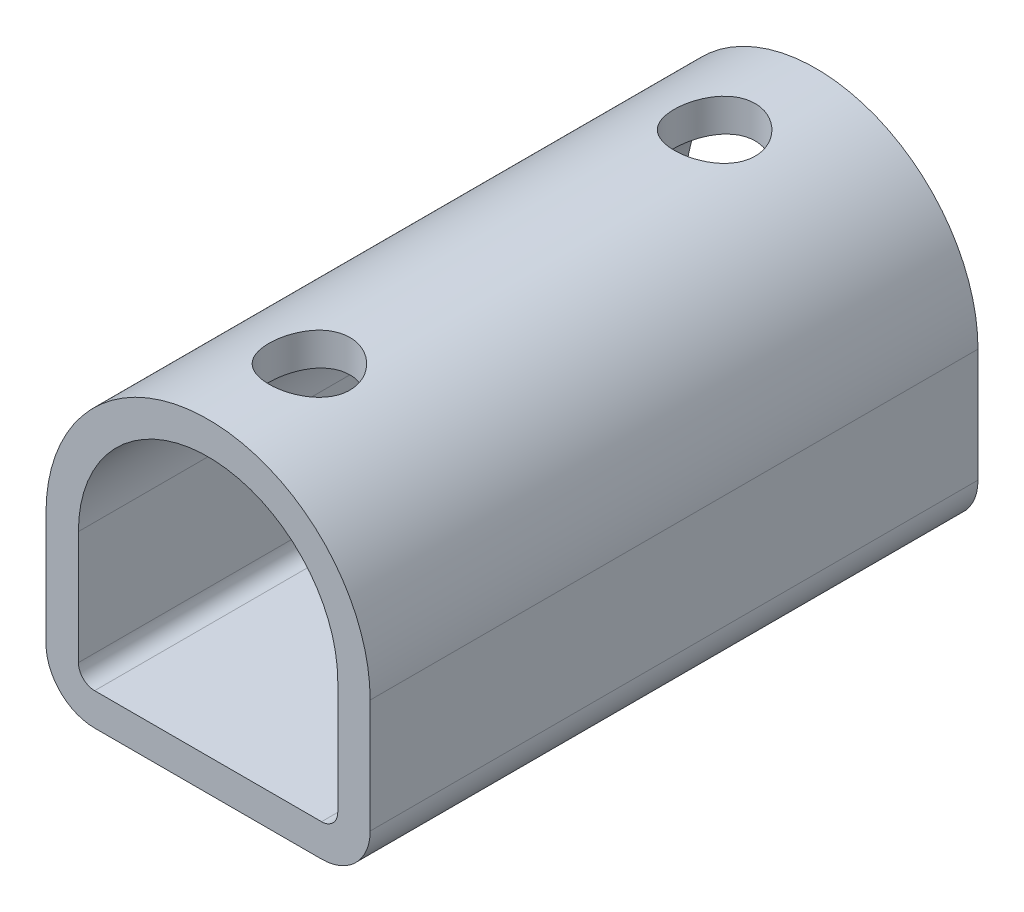
ISO-10303-21;
HEADER;
FILE_DESCRIPTION(('STEP AP214'),'2;1');
FILE_NAME('part.step','',(''),(''),'','','');
FILE_SCHEMA(('AUTOMOTIVE_DESIGN { 1 0 10303 214 1 1 1 1 }'));
ENDSEC;
DATA;
#1=APPLICATION_CONTEXT('core data for automotive mechanical design processes');
#2=APPLICATION_PROTOCOL_DEFINITION('international standard','automotive_design',2000,#1);
#3=PRODUCT_CONTEXT('',#1,'mechanical');
#4=PRODUCT('Part','Part','',(#3));
#5=PRODUCT_RELATED_PRODUCT_CATEGORY('part','',(#4));
#6=PRODUCT_DEFINITION_FORMATION('','',#4);
#7=PRODUCT_DEFINITION_CONTEXT('part definition',#1,'design');
#8=PRODUCT_DEFINITION('design','',#6,#7);
#9=PRODUCT_DEFINITION_SHAPE('','',#8);
#10=(LENGTH_UNIT() NAMED_UNIT(*) SI_UNIT(.MILLI.,.METRE.));
#11=(NAMED_UNIT(*) PLANE_ANGLE_UNIT() SI_UNIT($,.RADIAN.));
#12=(NAMED_UNIT(*) SI_UNIT($,.STERADIAN.) SOLID_ANGLE_UNIT());
#13=UNCERTAINTY_MEASURE_WITH_UNIT(LENGTH_MEASURE(1.E-05),#10,'distance_accuracy_value','');
#14=(GEOMETRIC_REPRESENTATION_CONTEXT(3) GLOBAL_UNCERTAINTY_ASSIGNED_CONTEXT((#13)) GLOBAL_UNIT_ASSIGNED_CONTEXT((#10,
#11,#12)) REPRESENTATION_CONTEXT('',''));
#15=CARTESIAN_POINT('',(0.,0.,0.));
#16=DIRECTION('',(0.,0.,1.));
#17=DIRECTION('',(1.,0.,0.));
#18=AXIS2_PLACEMENT_3D('',#15,#16,#17);
#19=CARTESIAN_POINT('',(-0.641711229946523,13.4224598930481,75.));
#20=DIRECTION('',(0.,0.,-1.));
#21=DIRECTION('',(-1.,0.,0.));
#22=AXIS2_PLACEMENT_3D('',#19,#20,#21);
#23=CYLINDRICAL_SURFACE('',#22,20.);
#24=CARTESIAN_POINT('',(-0.641711229946523,13.4224598930481,0.));
#25=DIRECTION('',(0.,0.,1.));
#26=DIRECTION('',(-1.,0.,0.));
#27=AXIS2_PLACEMENT_3D('',#24,#25,#26);
#28=CIRCLE('',#27,20.);
#29=CARTESIAN_POINT('',(19.3582887700535,13.4224598930481,0.));
#30=VERTEX_POINT('',#29);
#31=CARTESIAN_POINT('',(-20.6417112299465,13.4224598930481,0.));
#32=VERTEX_POINT('',#31);
#33=EDGE_CURVE('E149',#30,#32,#28,.T.);
#34=ORIENTED_EDGE('',*,*,#33,.T.);
#35=DIRECTION('',(0.,0.,-1.));
#36=VECTOR('',#35,1.);
#37=CARTESIAN_POINT('',(-20.6417112299465,13.4224598930481,75.));
#38=LINE('',#37,#36);
#39=CARTESIAN_POINT('',(-20.6417112299465,13.4224598930481,75.));
#40=VERTEX_POINT('',#39);
#41=EDGE_CURVE('E11',#40,#32,#38,.T.);
#42=ORIENTED_EDGE('',*,*,#41,.F.);
#43=CARTESIAN_POINT('',(-0.641711229946523,13.4224598930481,75.));
#44=DIRECTION('',(0.,0.,1.));
#45=DIRECTION('',(-1.,0.,0.));
#46=AXIS2_PLACEMENT_3D('',#43,#44,#45);
#47=CIRCLE('',#46,20.);
#48=CARTESIAN_POINT('',(19.3582887700535,13.4224598930481,75.));
#49=VERTEX_POINT('',#48);
#50=EDGE_CURVE('E187',#49,#40,#47,.T.);
#51=ORIENTED_EDGE('',*,*,#50,.F.);
#52=DIRECTION('',(0.,0.,-1.));
#53=VECTOR('',#52,1.);
#54=CARTESIAN_POINT('',(19.3582887700535,13.4224598930481,75.));
#55=LINE('',#54,#53);
#56=EDGE_CURVE('E201',#49,#30,#55,.T.);
#57=ORIENTED_EDGE('',*,*,#56,.T.);
#58=EDGE_LOOP('',(#34,#42,#51,#57));
#59=FACE_BOUND('',#58,.T.);
#60=CARTESIAN_POINT('',(-0.641711229946518,33.4224598930481,57.5));
#61=CARTESIAN_POINT('',(-0.917964858845621,33.4224552219819,57.5000077524605));
#62=CARTESIAN_POINT('',(-1.19430508938239,33.416679164109,57.5229718359126));
#63=CARTESIAN_POINT('',(-1.73906564251496,33.3941970207113,57.61408383769));
#64=CARTESIAN_POINT('',(-2.00748138618232,33.3774847403807,57.6822573651262));
#65=CARTESIAN_POINT('',(-2.52844747055511,33.3349807707825,57.8614641782069));
#66=CARTESIAN_POINT('',(-2.78101644137986,33.3091999877834,57.9724459957176));
#67=CARTESIAN_POINT('',(-3.26395166962794,33.2513046866355,58.2339379668161));
#68=CARTESIAN_POINT('',(-3.49431717777573,33.2191899548533,58.3844494537299));
#69=CARTESIAN_POINT('',(-3.93105098761624,33.1513736794379,58.7240026321806));
#70=CARTESIAN_POINT('',(-4.13689686348338,33.1156167979857,58.9137052498635));
#71=CARTESIAN_POINT('',(-4.51420765395758,33.0449138969793,59.3248406830301));
#72=CARTESIAN_POINT('',(-4.68566868644382,33.009967969377,59.5462770764898));
#73=CARTESIAN_POINT('',(-4.9917997059431,32.9442857496537,60.01865075579));
#74=CARTESIAN_POINT('',(-5.12588528303032,32.9136197085418,60.2699774360291));
#75=CARTESIAN_POINT('',(-5.34970092511567,32.860776386982,60.7924947055334));
#76=CARTESIAN_POINT('',(-5.43943808141366,32.8385977495287,61.0636821111067));
#77=CARTESIAN_POINT('',(-5.57022735262907,32.8058091162589,61.6124783273389));
#78=CARTESIAN_POINT('',(-5.61221879105337,32.7949762596152,61.88984965346));
#79=CARTESIAN_POINT('',(-5.64925048016788,32.7854386417012,62.4478952299978));
#80=CARTESIAN_POINT('',(-5.64429836934023,32.7867319073124,62.7285689356405));
#81=CARTESIAN_POINT('',(-5.58833297874554,32.801100076942,63.2780526924845));
#82=CARTESIAN_POINT('',(-5.53843903058197,32.8138886599579,63.5469854048844));
#83=CARTESIAN_POINT('',(-5.3957918529565,32.8493502154171,64.0725368363702));
#84=CARTESIAN_POINT('',(-5.30303557017784,32.8720238920227,64.3291546767631));
#85=CARTESIAN_POINT('',(-5.07634282307048,32.9249636899034,64.8257933875071));
#86=CARTESIAN_POINT('',(-4.94200012072293,32.955304142042,65.0656205726319));
#87=CARTESIAN_POINT('',(-4.63623214999635,33.0201169212478,65.5197290325227));
#88=CARTESIAN_POINT('',(-4.46480039264265,33.0545899708691,65.7340058268908));
#89=CARTESIAN_POINT('',(-4.08392264555059,33.1249892443778,66.137345385648));
#90=CARTESIAN_POINT('',(-3.8735320904994,33.1609288756482,66.3255149668712));
#91=CARTESIAN_POINT('',(-3.42375095495886,33.22932541234,66.664070808213));
#92=CARTESIAN_POINT('',(-3.18435948897301,33.2617822113617,66.8144559142119));
#93=CARTESIAN_POINT('',(-2.68209752555116,33.3197176295211,67.0735019540813));
#94=CARTESIAN_POINT('',(-2.4191492073086,33.3451718973057,67.1820178008481));
#95=CARTESIAN_POINT('',(-1.87796459042279,33.3860571260953,67.3530576856986));
#96=CARTESIAN_POINT('',(-1.5997312271148,33.4014900043575,67.4155905213938));
#97=CARTESIAN_POINT('',(-1.04351113124661,33.4203098687606,67.4915252185295));
#98=CARTESIAN_POINT('',(-0.765700296573885,33.4239950099907,67.506143420251));
#99=CARTESIAN_POINT('',(-0.211601647274823,33.4197533868632,67.4891699931484));
#100=CARTESIAN_POINT('',(0.0646863022021362,33.4118276677766,67.4575825240029));
#101=CARTESIAN_POINT('',(0.603669665975113,33.3854459306265,67.3500969720288));
#102=CARTESIAN_POINT('',(0.866505833282642,33.367147699241,67.2748624550767));
#103=CARTESIAN_POINT('',(1.37581307822853,33.3220834475201,67.0829763865718));
#104=CARTESIAN_POINT('',(1.62228250016232,33.2953165720476,66.9663206522893));
#105=CARTESIAN_POINT('',(2.09669921815291,33.2355701572553,66.6925462370844));
#106=CARTESIAN_POINT('',(2.32424024283936,33.2024888052675,66.5347462920114));
#107=CARTESIAN_POINT('',(2.75004414886452,33.1339435326405,66.1840336373428));
#108=CARTESIAN_POINT('',(2.94830196663099,33.0984792014821,65.9911148679412));
#109=CARTESIAN_POINT('',(3.31492399696174,33.0280917916956,65.5699934638543));
#110=CARTESIAN_POINT('',(3.4824349954571,32.9932033657881,65.3410409900013));
#111=CARTESIAN_POINT('',(3.77665796676562,32.9288891724588,64.8575578851049));
#112=CARTESIAN_POINT('',(3.90337175059171,32.8994631625817,64.6030283900992));
#113=CARTESIAN_POINT('',(4.11146017207774,32.8497297169069,64.0769809253119));
#114=CARTESIAN_POINT('',(4.19310342553132,32.8293684004357,63.8055745722898));
#115=CARTESIAN_POINT('',(4.30944096986405,32.8000180273084,63.2523012071515));
#116=CARTESIAN_POINT('',(4.34414552830944,32.7910264836088,62.9704364966046));
#117=CARTESIAN_POINT('',(4.36508407117276,32.7856232666142,62.4129299204403));
#118=CARTESIAN_POINT('',(4.35268176264464,32.7888576490931,62.1373418828543));
#119=CARTESIAN_POINT('',(4.28287969775002,32.8067235247795,61.592320371061));
#120=CARTESIAN_POINT('',(4.22548084567455,32.8213547889449,61.3228867732805));
#121=CARTESIAN_POINT('',(4.06805983486751,32.8601685829669,60.7993051364666));
#122=CARTESIAN_POINT('',(3.96829345232267,32.8842937343911,60.5450756492041));
#123=CARTESIAN_POINT('',(3.72917181540246,32.9393850837431,60.0567820576162));
#124=CARTESIAN_POINT('',(3.58981107016711,32.9703522303712,59.8227207560423));
#125=CARTESIAN_POINT('',(3.27118126551096,33.0366477018688,59.3748179033279));
#126=CARTESIAN_POINT('',(3.0909659797611,33.0720687207833,59.1616630885872));
#127=CARTESIAN_POINT('',(2.69758667401918,33.1427274679144,58.7681765173483));
#128=CARTESIAN_POINT('',(2.48441484092395,33.1779651506141,58.58785256629));
#129=CARTESIAN_POINT('',(2.02651405906214,33.2450484146396,58.2619623047847));
#130=CARTESIAN_POINT('',(1.78128351110811,33.2768210052445,58.1170846210948));
#131=CARTESIAN_POINT('',(1.2691756350884,33.3326240588847,57.8708417901982));
#132=CARTESIAN_POINT('',(1.00231398150928,33.356660066374,57.7694454645049));
#133=CARTESIAN_POINT('',(0.506322947531724,33.390728545233,57.6280938989011));
#134=CARTESIAN_POINT('',(0.279556006413713,33.4025460614712,57.5801625231552));
#135=CARTESIAN_POINT('',(-0.17869099149224,33.4184134007797,57.5161135212602));
#136=CARTESIAN_POINT('',(-0.41017069247113,33.4224638080779,57.4999935023157));
#137=CARTESIAN_POINT('',(-0.641711229946518,33.4224598930481,57.5));
#138=B_SPLINE_CURVE_WITH_KNOTS('',3,(#60,#61,#62,#63,#64,#65,#66,#67,#68,#69,#70,#71,#72,#73,
#74,#75,#76,#77,#78,#79,#80,#81,#82,#83,#84,#85,#86,#87,#88,#89,#90,#91,#92,#93,#94,#95,#96,#97,
#98,#99,#100,#101,#102,#103,#104,#105,#106,#107,#108,#109,#110,#111,#112,#113,#114,#115,#116,
#117,#118,#119,#120,#121,#122,#123,#124,#125,#126,#127,#128,#129,#130,#131,#132,#133,#134,#135,
#136,#137),.UNSPECIFIED.,.T.,.F.,(4,2,2,2,2,2,2,2,2,2,2,2,2,2,2,2,2,2,2,2,2,2,2,2,2,2,2,2,2,2,2,
2,2,2,2,2,2,2,4),(0.,0.827912374906299,1.65629412587966,2.48368300762035,3.31109980056443,
4.1538145145713,4.9966243193354,5.85195491819357,6.70714870564561,7.54520983670234,
8.38313460386726,9.20074990034463,10.0184234489786,10.84435092924,11.6704230279828,
12.5200500324113,13.3697029853856,14.2222743004145,15.0746824563988,15.9052769650866,
16.7357967038688,17.5540091505786,18.372304244187,19.2051195856224,20.0380787670447,
20.8914836402599,21.7448506250943,22.5930751539527,23.4411141086095,24.2647926801851,
25.0884546987996,25.9072133522467,26.7260856048285,27.5663192139288,28.4067523259457,
29.2624061835847,30.1174454609768,30.8114080983367,31.5053185350331),.UNSPECIFIED.);
#139=CARTESIAN_POINT('',(-0.641711229946518,33.4224598930481,57.5));
#140=VERTEX_POINT('',#139);
#141=EDGE_CURVE('E231',#140,#140,#138,.T.);
#142=ORIENTED_EDGE('',*,*,#141,.F.);
#143=EDGE_LOOP('',(#142));
#144=FACE_BOUND('',#143,.T.);
#145=CARTESIAN_POINT('',(-0.641711229946524,33.4224598930481,7.49999999999999));
#146=CARTESIAN_POINT('',(-0.917964858845628,33.4224552219819,7.50000775246052));
#147=CARTESIAN_POINT('',(-1.1943050893824,33.416679164109,7.52297183591262));
#148=CARTESIAN_POINT('',(-1.73906564251497,33.3941970207113,7.61408383769001));
#149=CARTESIAN_POINT('',(-2.00748138618232,33.3774847403807,7.68225736512616));
#150=CARTESIAN_POINT('',(-2.52844747055511,33.3349807707825,7.86146417820694));
#151=CARTESIAN_POINT('',(-2.78101644137987,33.3091999877834,7.97244599571756));
#152=CARTESIAN_POINT('',(-3.26395166962795,33.2513046866355,8.23393796681613));
#153=CARTESIAN_POINT('',(-3.49431717777574,33.2191899548533,8.38444945372988));
#154=CARTESIAN_POINT('',(-3.93105098761624,33.1513736794379,8.72400263218059));
#155=CARTESIAN_POINT('',(-4.13689686348338,33.1156167979857,8.91370524986353));
#156=CARTESIAN_POINT('',(-4.51420765395759,33.0449138969793,9.32484068303011));
#157=CARTESIAN_POINT('',(-4.68566868644383,33.009967969377,9.54627707648978));
#158=CARTESIAN_POINT('',(-4.99179970594311,32.9442857496537,10.01865075579));
#159=CARTESIAN_POINT('',(-5.12588528303032,32.9136197085418,10.2699774360291));
#160=CARTESIAN_POINT('',(-5.34970092511567,32.860776386982,10.7924947055334));
#161=CARTESIAN_POINT('',(-5.43943808141366,32.8385977495287,11.0636821111067));
#162=CARTESIAN_POINT('',(-5.57022735262908,32.8058091162589,11.6124783273389));
#163=CARTESIAN_POINT('',(-5.61221879105337,32.7949762596152,11.88984965346));
#164=CARTESIAN_POINT('',(-5.64925048016789,32.7854386417012,12.4478952299978));
#165=CARTESIAN_POINT('',(-5.64429836934023,32.7867319073124,12.7285689356404));
#166=CARTESIAN_POINT('',(-5.58833297874554,32.801100076942,13.2780526924845));
#167=CARTESIAN_POINT('',(-5.53843903058197,32.8138886599579,13.5469854048844));
#168=CARTESIAN_POINT('',(-5.3957918529565,32.8493502154171,14.0725368363702));
#169=CARTESIAN_POINT('',(-5.30303557017784,32.8720238920227,14.3291546767631));
#170=CARTESIAN_POINT('',(-5.07634282307048,32.9249636899034,14.8257933875071));
#171=CARTESIAN_POINT('',(-4.94200012072292,32.955304142042,15.0656205726319));
#172=CARTESIAN_POINT('',(-4.63623214999635,33.0201169212478,15.5197290325227));
#173=CARTESIAN_POINT('',(-4.46480039264265,33.0545899708691,15.7340058268908));
#174=CARTESIAN_POINT('',(-4.08392264555059,33.1249892443778,16.137345385648));
#175=CARTESIAN_POINT('',(-3.8735320904994,33.1609288756482,16.3255149668712));
#176=CARTESIAN_POINT('',(-3.42375095495886,33.22932541234,16.664070808213));
#177=CARTESIAN_POINT('',(-3.18435948897301,33.2617822113617,16.8144559142119));
#178=CARTESIAN_POINT('',(-2.68209752555117,33.3197176295211,17.0735019540813));
#179=CARTESIAN_POINT('',(-2.41914920730861,33.3451718973057,17.1820178008481));
#180=CARTESIAN_POINT('',(-1.8779645904228,33.3860571260953,17.3530576856986));
#181=CARTESIAN_POINT('',(-1.59973122711481,33.4014900043575,17.4155905213938));
#182=CARTESIAN_POINT('',(-1.04351113124662,33.4203098687606,17.4915252185295));
#183=CARTESIAN_POINT('',(-0.765700296573892,33.4239950099907,17.506143420251));
#184=CARTESIAN_POINT('',(-0.21160164727483,33.4197533868632,17.4891699931484));
#185=CARTESIAN_POINT('',(0.0646863022021295,33.4118276677766,17.4575825240029));
#186=CARTESIAN_POINT('',(0.603669665975111,33.3854459306265,17.3500969720287));
#187=CARTESIAN_POINT('',(0.866505833282643,33.367147699241,17.2748624550768));
#188=CARTESIAN_POINT('',(1.37581307822853,33.3220834475201,17.0829763865718));
#189=CARTESIAN_POINT('',(1.62228250016232,33.2953165720476,16.9663206522893));
#190=CARTESIAN_POINT('',(2.09669921815291,33.2355701572553,16.6925462370844));
#191=CARTESIAN_POINT('',(2.32424024283936,33.2024888052675,16.5347462920114));
#192=CARTESIAN_POINT('',(2.75004414886452,33.1339435326405,16.1840336373428));
#193=CARTESIAN_POINT('',(2.94830196663099,33.0984792014821,15.9911148679412));
#194=CARTESIAN_POINT('',(3.31492399696174,33.0280917916956,15.5699934638543));
#195=CARTESIAN_POINT('',(3.4824349954571,32.9932033657881,15.3410409900013));
#196=CARTESIAN_POINT('',(3.77665796676562,32.9288891724588,14.8575578851049));
#197=CARTESIAN_POINT('',(3.90337175059171,32.8994631625817,14.6030283900992));
#198=CARTESIAN_POINT('',(4.11146017207774,32.8497297169069,14.0769809253119));
#199=CARTESIAN_POINT('',(4.19310342553132,32.8293684004357,13.8055745722898));
#200=CARTESIAN_POINT('',(4.30944096986404,32.8000180273084,13.2523012071515));
#201=CARTESIAN_POINT('',(4.34414552830943,32.7910264836088,12.9704364966046));
#202=CARTESIAN_POINT('',(4.36508407117276,32.7856232666142,12.4129299204403));
#203=CARTESIAN_POINT('',(4.35268176264463,32.7888576490931,12.1373418828543));
#204=CARTESIAN_POINT('',(4.28287969775002,32.8067235247795,11.592320371061));
#205=CARTESIAN_POINT('',(4.22548084567454,32.8213547889449,11.3228867732805));
#206=CARTESIAN_POINT('',(4.0680598348675,32.8601685829669,10.7993051364666));
#207=CARTESIAN_POINT('',(3.96829345232266,32.8842937343911,10.5450756492041));
#208=CARTESIAN_POINT('',(3.72917181540245,32.9393850837431,10.0567820576162));
#209=CARTESIAN_POINT('',(3.5898110701671,32.9703522303712,9.82272075604229));
#210=CARTESIAN_POINT('',(3.27118126551095,33.0366477018688,9.37481790332793));
#211=CARTESIAN_POINT('',(3.09096597976109,33.0720687207833,9.16166308858716));
#212=CARTESIAN_POINT('',(2.69758667401917,33.1427274679144,8.76817651734827));
#213=CARTESIAN_POINT('',(2.48441484092394,33.1779651506141,8.58785256629));
#214=CARTESIAN_POINT('',(2.02651405906214,33.2450484146396,8.26196230478473));
#215=CARTESIAN_POINT('',(1.78128351110811,33.2768210052445,8.11708462109476));
#216=CARTESIAN_POINT('',(1.26917563508839,33.3326240588847,7.8708417901982));
#217=CARTESIAN_POINT('',(1.00231398150927,33.356660066374,7.76944546450486));
#218=CARTESIAN_POINT('',(0.506322947531717,33.390728545233,7.62809389890115));
#219=CARTESIAN_POINT('',(0.279556006413706,33.4025460614712,7.58016252315521));
#220=CARTESIAN_POINT('',(-0.178690991492246,33.4184134007797,7.51611352126018));
#221=CARTESIAN_POINT('',(-0.410170692471136,33.4224638080779,7.49999350231565));
#222=CARTESIAN_POINT('',(-0.641711229946524,33.4224598930481,7.49999999999999));
#223=B_SPLINE_CURVE_WITH_KNOTS('',3,(#145,#146,#147,#148,#149,#150,#151,#152,#153,#154,#155,
#156,#157,#158,#159,#160,#161,#162,#163,#164,#165,#166,#167,#168,#169,#170,#171,#172,#173,#174,
#175,#176,#177,#178,#179,#180,#181,#182,#183,#184,#185,#186,#187,#188,#189,#190,#191,#192,#193,
#194,#195,#196,#197,#198,#199,#200,#201,#202,#203,#204,#205,#206,#207,#208,#209,#210,#211,#212,
#213,#214,#215,#216,#217,#218,#219,#220,#221,#222),.UNSPECIFIED.,.T.,.F.,(4,2,2,2,2,2,2,2,2,2,2,
2,2,2,2,2,2,2,2,2,2,2,2,2,2,2,2,2,2,2,2,2,2,2,2,2,2,2,4),(0.,0.827912374906299,1.65629412587967,
2.48368300762036,3.31109980056443,4.1538145145713,4.9966243193354,5.85195491819356,
6.70714870564561,7.54520983670233,8.38313460386726,9.20074990034463,10.0184234489786,
10.84435092924,11.6704230279828,12.5200500324113,13.3697029853856,14.2222743004145,
15.0746824563988,15.9052769650866,16.7357967038688,17.5540091505786,18.372304244187,
19.2051195856224,20.0380787670447,20.8914836402599,21.7448506250943,22.5930751539527,
23.4411141086095,24.2647926801851,25.0884546987996,25.9072133522467,26.7260856048285,
27.5663192139288,28.4067523259457,29.2624061835847,30.1174454609768,30.8114080983367,
31.5053185350331),.UNSPECIFIED.);
#224=CARTESIAN_POINT('',(-0.641711229946524,33.4224598930481,7.49999999999999));
#225=VERTEX_POINT('',#224);
#226=EDGE_CURVE('E167',#225,#225,#223,.T.);
#227=ORIENTED_EDGE('',*,*,#226,.F.);
#228=EDGE_LOOP('',(#227));
#229=FACE_BOUND('',#228,.T.);
#230=ADVANCED_FACE('F37',(#59,#144,#229),#23,.T.);
#231=CARTESIAN_POINT('',(-0.641711229946523,13.4224598930481,75.));
#232=DIRECTION('',(0.,0.,-1.));
#233=DIRECTION('',(-1.,0.,0.));
#234=AXIS2_PLACEMENT_3D('',#231,#232,#233);
#235=CYLINDRICAL_SURFACE('',#234,16.);
#236=CARTESIAN_POINT('',(-0.641711229946518,29.4224598930481,57.5));
#237=CARTESIAN_POINT('',(-0.915467970644697,29.4224585281676,57.5000017863503));
#238=CARTESIAN_POINT('',(-1.18924343995793,29.4153676924414,57.5225569077778));
#239=CARTESIAN_POINT('',(-1.72878806830034,29.3877756566007,57.611944966157));
#240=CARTESIAN_POINT('',(-1.99455540085025,29.3672714210438,57.6787879254576));
#241=CARTESIAN_POINT('',(-2.51022540454964,29.3150925209632,57.8542774847828));
#242=CARTESIAN_POINT('',(-2.76015193788936,29.2834351530041,57.9628593786113));
#243=CARTESIAN_POINT('',(-3.23825043933273,29.2122186594968,58.2184692707138));
#244=CARTESIAN_POINT('',(-3.46641897172746,29.172658289063,58.3655033271243));
#245=CARTESIAN_POINT('',(-3.9015725697542,29.0884684426402,58.6986239680674));
#246=CARTESIAN_POINT('',(-4.10779134256771,29.0437285300551,58.8856835402367));
#247=CARTESIAN_POINT('',(-4.48650075809994,28.954861748089,59.2914735696618));
#248=CARTESIAN_POINT('',(-4.65898512156166,28.9107349942574,59.5102099100066));
#249=CARTESIAN_POINT('',(-4.96948468925289,28.8269056806966,59.9797782552073));
#250=CARTESIAN_POINT('',(-5.10654259587762,28.7873394240702,60.2312699100077));
#251=CARTESIAN_POINT('',(-5.33610087293891,28.7187719639847,60.7551692598226));
#252=CARTESIAN_POINT('',(-5.42861298080505,28.6897679779508,61.0275714231434));
#253=CARTESIAN_POINT('',(-5.56364962716509,28.6467641726661,61.5769123098337));
#254=CARTESIAN_POINT('',(-5.6075956302627,28.6323388101933,61.8534673745682));
#255=CARTESIAN_POINT('',(-5.64869343142445,28.6188620987212,62.4103724756348));
#256=CARTESIAN_POINT('',(-5.64585766978824,28.6198066625198,62.690721483261));
#257=CARTESIAN_POINT('',(-5.59458421924469,28.6365874557026,63.2354978411111));
#258=CARTESIAN_POINT('',(-5.54795354467587,28.6518335614951,63.5001165035519));
#259=CARTESIAN_POINT('',(-5.41334376412613,28.6945409177491,64.017568626249));
#260=CARTESIAN_POINT('',(-5.32536026371839,28.7220034663948,64.2704008308583));
#261=CARTESIAN_POINT('',(-5.10926621721175,28.7865016540023,64.7614077776984));
#262=CARTESIAN_POINT('',(-4.98058825643359,28.8236712795837,64.9993144427593));
#263=CARTESIAN_POINT('',(-4.68715205945666,28.9033341561483,65.4507510715251));
#264=CARTESIAN_POINT('',(-4.52238445080858,28.9458287888021,65.6642746810172));
#265=CARTESIAN_POINT('',(-4.1525790466761,29.0337210050972,66.0710997736655));
#266=CARTESIAN_POINT('',(-3.94604951231808,29.0791626772838,66.2630382311181));
#267=CARTESIAN_POINT('',(-3.50316886232835,29.1661227234235,66.6098875743194));
#268=CARTESIAN_POINT('',(-3.26681553934252,29.2076408065809,66.764795716877));
#269=CARTESIAN_POINT('',(-2.76836967180842,29.2825116886579,67.0341107544049));
#270=CARTESIAN_POINT('',(-2.50609085762366,29.315798318977,67.1481925418558));
#271=CARTESIAN_POINT('',(-1.96478314107707,29.3699781261897,67.3302120034063));
#272=CARTESIAN_POINT('',(-1.68575935284494,29.3908750660541,67.3981636889536));
#273=CARTESIAN_POINT('',(-1.1304518591079,29.4173154688488,67.4836721703159));
#274=CARTESIAN_POINT('',(-0.854478625101891,29.4234208088656,67.5030741743741));
#275=CARTESIAN_POINT('',(-0.303190007016174,29.4212518822874,67.4961350934507));
#276=CARTESIAN_POINT('',(-0.0278745327204834,29.4129797162935,67.4698006907096));
#277=CARTESIAN_POINT('',(0.507166101956876,29.3833544438386,67.3736176295745));
#278=CARTESIAN_POINT('',(0.767108683737228,29.3623316174756,67.3048669295501));
#279=CARTESIAN_POINT('',(1.27169648549899,29.3096647482197,67.1271425905331));
#280=CARTESIAN_POINT('',(1.51633981184971,29.2780193936219,67.0181639839));
#281=CARTESIAN_POINT('',(1.99001839674223,29.2064016034251,66.7601071338053));
#282=CARTESIAN_POINT('',(2.21852772920464,29.1662449657548,66.6101160500127));
#283=CARTESIAN_POINT('',(2.64775217389451,29.0821962931853,66.2753871595303));
#284=CARTESIAN_POINT('',(2.84845972222928,29.0383032469636,66.0906399290214));
#285=CARTESIAN_POINT('',(3.22463862172956,28.9495396883738,65.6829644397916));
#286=CARTESIAN_POINT('',(3.39879486363473,28.9046993613058,65.4588133450431));
#287=CARTESIAN_POINT('',(3.70713877985954,28.8209377768724,64.9834935344929));
#288=CARTESIAN_POINT('',(3.84132708899067,28.7820164255005,64.7323252478921));
#289=CARTESIAN_POINT('',(4.06509210927517,28.7149311862829,64.2106193085181));
#290=CARTESIAN_POINT('',(4.15484155229398,28.6867257473231,63.9401614022571));
#291=CARTESIAN_POINT('',(4.28720454277709,28.6445067268205,63.3869100270055));
#292=CARTESIAN_POINT('',(4.32983602661327,28.6304877450972,63.1041212946259));
#293=CARTESIAN_POINT('',(4.36546501637851,28.6187916016032,62.5479836496783));
#294=CARTESIAN_POINT('',(4.36061995491892,28.6204040770538,62.2747861846103));
#295=CARTESIAN_POINT('',(4.30664149520684,28.6380635080843,61.7333016602323));
#296=CARTESIAN_POINT('',(4.25751016295397,28.6541097903123,61.4650143724531));
#297=CARTESIAN_POINT('',(4.11779796659819,28.6983324603837,60.9448238416324));
#298=CARTESIAN_POINT('',(4.02783446629382,28.7263278206584,60.6927382356266));
#299=CARTESIAN_POINT('',(3.80949786345347,28.7912480632307,60.207038345864));
#300=CARTESIAN_POINT('',(3.68111694782296,28.828174761635,59.9734278316864));
#301=CARTESIAN_POINT('',(3.38371577059322,28.9085993743882,59.5214161182408));
#302=CARTESIAN_POINT('',(3.21330211101878,28.9522978499664,59.303967481999));
#303=CARTESIAN_POINT('',(2.83912475567269,29.0404198458965,58.900054687552));
#304=CARTESIAN_POINT('',(2.63535213943105,29.0848435573143,58.7135988440358));
#305=CARTESIAN_POINT('',(2.19223542134687,29.1711507711471,58.3708698465483));
#306=CARTESIAN_POINT('',(1.95194706800303,29.212903962275,58.2157810542002));
#307=CARTESIAN_POINT('',(1.44740532210809,29.2875306649232,57.9484043394422));
#308=CARTESIAN_POINT('',(1.18316140123528,29.320407665681,57.8360995914327));
#309=CARTESIAN_POINT('',(0.661279311549402,29.3712859223869,57.6656345295661));
#310=CARTESIAN_POINT('',(0.404970118503672,29.3903095252938,57.6037005307786));
#311=CARTESIAN_POINT('',(-0.114791648185529,29.4158959066675,57.5208865601291));
#312=CARTESIAN_POINT('',(-0.378242765387825,29.4224612066339,57.499998280784));
#313=CARTESIAN_POINT('',(-0.641711229946518,29.4224598930481,57.5));
#314=B_SPLINE_CURVE_WITH_KNOTS('',3,(#236,#237,#238,#239,#240,#241,#242,#243,#244,#245,#246,
#247,#248,#249,#250,#251,#252,#253,#254,#255,#256,#257,#258,#259,#260,#261,#262,#263,#264,#265,
#266,#267,#268,#269,#270,#271,#272,#273,#274,#275,#276,#277,#278,#279,#280,#281,#282,#283,#284,
#285,#286,#287,#288,#289,#290,#291,#292,#293,#294,#295,#296,#297,#298,#299,#300,#301,#302,#303,
#304,#305,#306,#307,#308,#309,#310,#311,#312,#313),.UNSPECIFIED.,.T.,.F.,(4,2,2,2,2,2,2,2,2,2,2,
2,2,2,2,2,2,2,2,2,2,2,2,2,2,2,2,2,2,2,2,2,2,2,2,2,2,2,4),(0.,0.82030179773004,1.64078929339627,
2.46000991680975,3.27935968623357,4.12151288780634,4.96382269725105,5.82695084991454,
6.68985145121464,7.52676600672195,8.36345801183909,9.16707669695195,9.97078079925601,
10.7862257089153,11.6018826405078,12.4546698912775,13.3075202966256,14.1670184276843,
15.0262553798757,15.852302742023,16.678229426068,17.4836250690084,18.2891202014735,
19.1142529896272,19.9396098284639,20.7976711486191,21.655718839442,22.5104046302277,
23.3647649559871,24.1804881394266,24.9961732705188,25.7999165363423,26.6038233736824,
27.4391805607299,28.274761495409,29.1376267255319,30.0001522671289,30.7897854665371,
31.5792588309973),.UNSPECIFIED.);
#315=CARTESIAN_POINT('',(-0.641711229946518,29.4224598930481,57.5));
#316=VERTEX_POINT('',#315);
#317=EDGE_CURVE('E225',#316,#316,#314,.T.);
#318=ORIENTED_EDGE('',*,*,#317,.T.);
#319=EDGE_LOOP('',(#318));
#320=FACE_BOUND('',#319,.T.);
#321=CARTESIAN_POINT('',(-0.641711229946523,13.4224598930481,0.));
#322=DIRECTION('',(0.,0.,1.));
#323=DIRECTION('',(-1.,0.,0.));
#324=AXIS2_PLACEMENT_3D('',#321,#322,#323);
#325=CIRCLE('',#324,16.);
#326=CARTESIAN_POINT('',(15.3582887700535,13.4224598930481,0.));
#327=VERTEX_POINT('',#326);
#328=CARTESIAN_POINT('',(-16.6417112299465,13.4224598930481,0.));
#329=VERTEX_POINT('',#328);
#330=EDGE_CURVE('E169',#327,#329,#325,.T.);
#331=ORIENTED_EDGE('',*,*,#330,.F.);
#332=DIRECTION('',(0.,0.,-1.));
#333=VECTOR('',#332,1.);
#334=CARTESIAN_POINT('',(15.3582887700535,13.4224598930481,75.));
#335=LINE('',#334,#333);
#336=CARTESIAN_POINT('',(15.3582887700535,13.4224598930481,75.));
#337=VERTEX_POINT('',#336);
#338=EDGE_CURVE('E150',#337,#327,#335,.T.);
#339=ORIENTED_EDGE('',*,*,#338,.F.);
#340=CARTESIAN_POINT('',(-0.641711229946523,13.4224598930481,75.));
#341=DIRECTION('',(0.,0.,1.));
#342=DIRECTION('',(-1.,0.,0.));
#343=AXIS2_PLACEMENT_3D('',#340,#341,#342);
#344=CIRCLE('',#343,16.);
#345=CARTESIAN_POINT('',(-16.6417112299465,13.4224598930481,75.));
#346=VERTEX_POINT('',#345);
#347=EDGE_CURVE('E155',#337,#346,#344,.T.);
#348=ORIENTED_EDGE('',*,*,#347,.T.);
#349=DIRECTION('',(0.,0.,-1.));
#350=VECTOR('',#349,1.);
#351=CARTESIAN_POINT('',(-16.6417112299465,13.4224598930481,75.));
#352=LINE('',#351,#350);
#353=EDGE_CURVE('E184',#346,#329,#352,.T.);
#354=ORIENTED_EDGE('',*,*,#353,.T.);
#355=EDGE_LOOP('',(#331,#339,#348,#354));
#356=FACE_BOUND('',#355,.T.);
#357=CARTESIAN_POINT('',(-0.641711229946524,29.4224598930481,7.49999999999999));
#358=CARTESIAN_POINT('',(-0.915467970644703,29.4224585281676,7.50000178635029));
#359=CARTESIAN_POINT('',(-1.18924343995793,29.4153676924414,7.52255690777777));
#360=CARTESIAN_POINT('',(-1.72878806830034,29.3877756566007,7.61194496615697));
#361=CARTESIAN_POINT('',(-1.99455540085025,29.3672714210438,7.67878792545756));
#362=CARTESIAN_POINT('',(-2.51022540454965,29.3150925209632,7.8542774847828));
#363=CARTESIAN_POINT('',(-2.76015193788936,29.2834351530041,7.96285937861133));
#364=CARTESIAN_POINT('',(-3.23825043933274,29.2122186594968,8.21846927071383));
#365=CARTESIAN_POINT('',(-3.46641897172747,29.172658289063,8.36550332712429));
#366=CARTESIAN_POINT('',(-3.90157256975421,29.0884684426402,8.69862396806742));
#367=CARTESIAN_POINT('',(-4.10779134256772,29.0437285300551,8.88568354023668));
#368=CARTESIAN_POINT('',(-4.48650075809995,28.954861748089,9.29147356966178));
#369=CARTESIAN_POINT('',(-4.65898512156167,28.9107349942574,9.51020991000656));
#370=CARTESIAN_POINT('',(-4.9694846892529,28.8269056806966,9.97977825520731));
#371=CARTESIAN_POINT('',(-5.10654259587762,28.7873394240702,10.2312699100077));
#372=CARTESIAN_POINT('',(-5.33610087293891,28.7187719639847,10.7551692598226));
#373=CARTESIAN_POINT('',(-5.42861298080506,28.6897679779508,11.0275714231434));
#374=CARTESIAN_POINT('',(-5.56364962716509,28.6467641726661,11.5769123098337));
#375=CARTESIAN_POINT('',(-5.60759563026271,28.6323388101933,11.8534673745682));
#376=CARTESIAN_POINT('',(-5.64869343142446,28.6188620987212,12.4103724756348));
#377=CARTESIAN_POINT('',(-5.64585766978825,28.6198066625198,12.690721483261));
#378=CARTESIAN_POINT('',(-5.5945842192447,28.6365874557026,13.2354978411111));
#379=CARTESIAN_POINT('',(-5.54795354467587,28.6518335614951,13.5001165035519));
#380=CARTESIAN_POINT('',(-5.41334376412614,28.6945409177491,14.017568626249));
#381=CARTESIAN_POINT('',(-5.3253602637184,28.7220034663948,14.2704008308583));
#382=CARTESIAN_POINT('',(-5.10926621721175,28.7865016540023,14.7614077776984));
#383=CARTESIAN_POINT('',(-4.98058825643359,28.8236712795837,14.9993144427593));
#384=CARTESIAN_POINT('',(-4.68715205945666,28.9033341561483,15.4507510715251));
#385=CARTESIAN_POINT('',(-4.52238445080858,28.9458287888021,15.6642746810172));
#386=CARTESIAN_POINT('',(-4.15257904667611,29.0337210050972,16.0710997736655));
#387=CARTESIAN_POINT('',(-3.94604951231809,29.0791626772838,16.2630382311181));
#388=CARTESIAN_POINT('',(-3.50316886232836,29.1661227234235,16.6098875743194));
#389=CARTESIAN_POINT('',(-3.26681553934253,29.2076408065809,16.764795716877));
#390=CARTESIAN_POINT('',(-2.76836967180842,29.2825116886579,17.0341107544049));
#391=CARTESIAN_POINT('',(-2.50609085762367,29.315798318977,17.1481925418558));
#392=CARTESIAN_POINT('',(-1.96478314107708,29.3699781261897,17.3302120034063));
#393=CARTESIAN_POINT('',(-1.68575935284496,29.3908750660541,17.3981636889536));
#394=CARTESIAN_POINT('',(-1.13045185910791,29.4173154688488,17.4836721703159));
#395=CARTESIAN_POINT('',(-0.8544786251019,29.4234208088656,17.5030741743741));
#396=CARTESIAN_POINT('',(-0.303190007016182,29.4212518822874,17.4961350934507));
#397=CARTESIAN_POINT('',(-0.02787453272049,29.4129797162935,17.4698006907096));
#398=CARTESIAN_POINT('',(0.50716610195687,29.3833544438386,17.3736176295745));
#399=CARTESIAN_POINT('',(0.767108683737221,29.3623316174756,17.3048669295501));
#400=CARTESIAN_POINT('',(1.27169648549898,29.3096647482197,17.1271425905331));
#401=CARTESIAN_POINT('',(1.51633981184971,29.2780193936219,17.0181639838999));
#402=CARTESIAN_POINT('',(1.99001839674223,29.2064016034251,16.7601071338053));
#403=CARTESIAN_POINT('',(2.21852772920464,29.1662449657548,16.6101160500128));
#404=CARTESIAN_POINT('',(2.64775217389452,29.0821962931853,16.2753871595303));
#405=CARTESIAN_POINT('',(2.84845972222928,29.0383032469636,16.0906399290214));
#406=CARTESIAN_POINT('',(3.22463862172955,28.9495396883738,15.6829644397916));
#407=CARTESIAN_POINT('',(3.39879486363473,28.9046993613058,15.4588133450431));
#408=CARTESIAN_POINT('',(3.70713877985954,28.8209377768724,14.9834935344929));
#409=CARTESIAN_POINT('',(3.84132708899066,28.7820164255005,14.7323252478921));
#410=CARTESIAN_POINT('',(4.06509210927517,28.7149311862829,14.2106193085181));
#411=CARTESIAN_POINT('',(4.15484155229398,28.6867257473231,13.9401614022571));
#412=CARTESIAN_POINT('',(4.28720454277708,28.6445067268205,13.3869100270055));
#413=CARTESIAN_POINT('',(4.32983602661326,28.6304877450972,13.1041212946259));
#414=CARTESIAN_POINT('',(4.36546501637851,28.6187916016032,12.5479836496783));
#415=CARTESIAN_POINT('',(4.36061995491891,28.6204040770538,12.2747861846103));
#416=CARTESIAN_POINT('',(4.30664149520683,28.6380635080843,11.7333016602322));
#417=CARTESIAN_POINT('',(4.25751016295396,28.6541097903123,11.465014372453));
#418=CARTESIAN_POINT('',(4.11779796659818,28.6983324603837,10.9448238416324));
#419=CARTESIAN_POINT('',(4.02783446629381,28.7263278206584,10.6927382356266));
#420=CARTESIAN_POINT('',(3.80949786345346,28.7912480632307,10.207038345864));
#421=CARTESIAN_POINT('',(3.68111694782295,28.828174761635,9.97342783168638));
#422=CARTESIAN_POINT('',(3.38371577059321,28.9085993743882,9.52141611824074));
#423=CARTESIAN_POINT('',(3.21330211101877,28.9522978499664,9.30396748199903));
#424=CARTESIAN_POINT('',(2.83912475567268,29.0404198458965,8.900054687552));
#425=CARTESIAN_POINT('',(2.63535213943104,29.0848435573143,8.71359884403575));
#426=CARTESIAN_POINT('',(2.19223542134686,29.1711507711471,8.37086984654827));
#427=CARTESIAN_POINT('',(1.95194706800302,29.212903962275,8.21578105420019));
#428=CARTESIAN_POINT('',(1.44740532210808,29.2875306649232,7.94840433944218));
#429=CARTESIAN_POINT('',(1.18316140123527,29.320407665681,7.83609959143265));
#430=CARTESIAN_POINT('',(0.661279311549392,29.3712859223869,7.66563452956614));
#431=CARTESIAN_POINT('',(0.404970118503663,29.3903095252938,7.60370053077864));
#432=CARTESIAN_POINT('',(-0.114791648185536,29.4158959066675,7.52088656012913));
#433=CARTESIAN_POINT('',(-0.378242765387832,29.4224612066339,7.49999828078399));
#434=CARTESIAN_POINT('',(-0.641711229946524,29.4224598930481,7.49999999999999));
#435=B_SPLINE_CURVE_WITH_KNOTS('',3,(#357,#358,#359,#360,#361,#362,#363,#364,#365,#366,#367,
#368,#369,#370,#371,#372,#373,#374,#375,#376,#377,#378,#379,#380,#381,#382,#383,#384,#385,#386,
#387,#388,#389,#390,#391,#392,#393,#394,#395,#396,#397,#398,#399,#400,#401,#402,#403,#404,#405,
#406,#407,#408,#409,#410,#411,#412,#413,#414,#415,#416,#417,#418,#419,#420,#421,#422,#423,#424,
#425,#426,#427,#428,#429,#430,#431,#432,#433,#434),.UNSPECIFIED.,.T.,.F.,(4,2,2,2,2,2,2,2,2,2,2,
2,2,2,2,2,2,2,2,2,2,2,2,2,2,2,2,2,2,2,2,2,2,2,2,2,2,2,4),(0.,0.82030179773004,1.64078929339627,
2.46000991680975,3.27935968623357,4.12151288780633,4.96382269725105,5.82695084991453,
6.68985145121464,7.52676600672195,8.36345801183909,9.16707669695195,9.97078079925602,
10.7862257089153,11.6018826405078,12.4546698912775,13.3075202966256,14.1670184276843,
15.0262553798757,15.852302742023,16.678229426068,17.4836250690084,18.2891202014735,
19.1142529896272,19.9396098284639,20.7976711486191,21.655718839442,22.5104046302278,
23.3647649559871,24.1804881394267,24.9961732705188,25.7999165363423,26.6038233736824,
27.4391805607299,28.2747614954091,29.1376267255319,30.0001522671289,30.7897854665371,
31.5792588309973),.UNSPECIFIED.);
#436=CARTESIAN_POINT('',(-0.641711229946524,29.4224598930481,7.49999999999999));
#437=VERTEX_POINT('',#436);
#438=EDGE_CURVE('E41',#437,#437,#435,.T.);
#439=ORIENTED_EDGE('',*,*,#438,.T.);
#440=EDGE_LOOP('',(#439));
#441=FACE_BOUND('',#440,.T.);
#442=ADVANCED_FACE('F232',(#320,#356,#441),#235,.F.);
#443=CARTESIAN_POINT('',(-0.641711229946523,13.4224598930481,75.));
#444=DIRECTION('',(0.,0.,-1.));
#445=DIRECTION('',(-1.,0.,0.));
#446=AXIS2_PLACEMENT_3D('',#443,#444,#445);
#447=PLANE('',#446);
#448=ORIENTED_EDGE('',*,*,#50,.T.);
#449=DIRECTION('',(0.,-1.,0.));
#450=VECTOR('',#449,1.);
#451=CARTESIAN_POINT('',(-20.6417112299465,-0.577540106951835,75.));
#452=LINE('',#451,#450);
#453=CARTESIAN_POINT('',(-20.6417112299465,-0.577540106951835,75.));
#454=VERTEX_POINT('',#453);
#455=EDGE_CURVE('E190',#40,#454,#452,.T.);
#456=ORIENTED_EDGE('',*,*,#455,.T.);
#457=CARTESIAN_POINT('',(-14.6417112299465,-0.577540106951878,75.));
#458=DIRECTION('',(0.,0.,1.));
#459=DIRECTION('',(1.,0.,0.));
#460=AXIS2_PLACEMENT_3D('',#457,#458,#459);
#461=CIRCLE('',#460,6.);
#462=CARTESIAN_POINT('',(-14.6417112299465,-6.57754010695188,75.));
#463=VERTEX_POINT('',#462);
#464=EDGE_CURVE('E193',#454,#463,#461,.T.);
#465=ORIENTED_EDGE('',*,*,#464,.T.);
#466=DIRECTION('',(1.,0.,0.));
#467=VECTOR('',#466,1.);
#468=CARTESIAN_POINT('',(13.3582887700534,-6.57754010695187,75.));
#469=LINE('',#468,#467);
#470=CARTESIAN_POINT('',(13.3582887700534,-6.57754010695187,75.));
#471=VERTEX_POINT('',#470);
#472=EDGE_CURVE('E195',#463,#471,#469,.T.);
#473=ORIENTED_EDGE('',*,*,#472,.T.);
#474=CARTESIAN_POINT('',(13.3582887700535,-0.577540106951872,75.));
#475=DIRECTION('',(0.,0.,1.));
#476=DIRECTION('',(-1.,0.,0.));
#477=AXIS2_PLACEMENT_3D('',#474,#475,#476);
#478=CIRCLE('',#477,6.);
#479=CARTESIAN_POINT('',(19.3582887700535,-0.577540106951829,75.));
#480=VERTEX_POINT('',#479);
#481=EDGE_CURVE('E197',#471,#480,#478,.T.);
#482=ORIENTED_EDGE('',*,*,#481,.T.);
#483=DIRECTION('',(0.,1.,0.));
#484=VECTOR('',#483,1.);
#485=CARTESIAN_POINT('',(19.3582887700535,13.4224598930481,75.));
#486=LINE('',#485,#484);
#487=EDGE_CURVE('E199',#480,#49,#486,.T.);
#488=ORIENTED_EDGE('',*,*,#487,.T.);
#489=EDGE_LOOP('',(#448,#456,#465,#473,#482,#488));
#490=FACE_BOUND('',#489,.T.);
#491=CARTESIAN_POINT('',(13.3582887700535,-0.577540106951872,75.));
#492=DIRECTION('',(0.,0.,1.));
#493=DIRECTION('',(-1.,0.,0.));
#494=AXIS2_PLACEMENT_3D('',#491,#492,#493);
#495=CIRCLE('',#494,2.);
#496=CARTESIAN_POINT('',(13.3582887700534,-2.57754010695187,75.));
#497=VERTEX_POINT('',#496);
#498=CARTESIAN_POINT('',(15.3582887700535,-0.577540106951827,75.));
#499=VERTEX_POINT('',#498);
#500=EDGE_CURVE('E133',#497,#499,#495,.T.);
#501=ORIENTED_EDGE('',*,*,#500,.F.);
#502=DIRECTION('',(1.,0.,0.));
#503=VECTOR('',#502,1.);
#504=CARTESIAN_POINT('',(13.3582887700534,-2.57754010695187,75.));
#505=LINE('',#504,#503);
#506=CARTESIAN_POINT('',(-14.6417112299465,-2.57754010695187,75.));
#507=VERTEX_POINT('',#506);
#508=EDGE_CURVE('E164',#507,#497,#505,.T.);
#509=ORIENTED_EDGE('',*,*,#508,.F.);
#510=CARTESIAN_POINT('',(-14.6417112299465,-0.577540106951878,75.));
#511=DIRECTION('',(0.,0.,1.));
#512=DIRECTION('',(1.,0.,0.));
#513=AXIS2_PLACEMENT_3D('',#510,#511,#512);
#514=CIRCLE('',#513,2.);
#515=CARTESIAN_POINT('',(-16.6417112299465,-0.577540106951863,75.));
#516=VERTEX_POINT('',#515);
#517=EDGE_CURVE('E162',#516,#507,#514,.T.);
#518=ORIENTED_EDGE('',*,*,#517,.F.);
#519=DIRECTION('',(0.,-1.,0.));
#520=VECTOR('',#519,1.);
#521=CARTESIAN_POINT('',(-16.6417112299465,-0.577540106951863,75.));
#522=LINE('',#521,#520);
#523=EDGE_CURVE('E157',#346,#516,#522,.T.);
#524=ORIENTED_EDGE('',*,*,#523,.F.);
#525=ORIENTED_EDGE('',*,*,#347,.F.);
#526=DIRECTION('',(0.,1.,0.));
#527=VECTOR('',#526,1.);
#528=CARTESIAN_POINT('',(15.3582887700535,13.4224598930481,75.));
#529=LINE('',#528,#527);
#530=EDGE_CURVE('E141',#499,#337,#529,.T.);
#531=ORIENTED_EDGE('',*,*,#530,.F.);
#532=EDGE_LOOP('',(#501,#509,#518,#524,#525,#531));
#533=FACE_BOUND('',#532,.T.);
#534=ADVANCED_FACE('F153',(#490,#533),#447,.F.);
#535=CARTESIAN_POINT('',(-0.641711229946523,13.4224598930481,0.));
#536=DIRECTION('',(0.,0.,-1.));
#537=DIRECTION('',(-1.,0.,0.));
#538=AXIS2_PLACEMENT_3D('',#535,#536,#537);
#539=PLANE('',#538);
#540=ORIENTED_EDGE('',*,*,#33,.F.);
#541=DIRECTION('',(0.,1.,0.));
#542=VECTOR('',#541,1.);
#543=CARTESIAN_POINT('',(19.3582887700535,13.4224598930481,0.));
#544=LINE('',#543,#542);
#545=CARTESIAN_POINT('',(19.3582887700535,-0.577540106951829,0.));
#546=VERTEX_POINT('',#545);
#547=EDGE_CURVE('E191',#546,#30,#544,.T.);
#548=ORIENTED_EDGE('',*,*,#547,.F.);
#549=CARTESIAN_POINT('',(13.3582887700535,-0.577540106951872,0.));
#550=DIRECTION('',(0.,0.,1.));
#551=DIRECTION('',(-1.,0.,0.));
#552=AXIS2_PLACEMENT_3D('',#549,#550,#551);
#553=CIRCLE('',#552,6.);
#554=CARTESIAN_POINT('',(13.3582887700534,-6.57754010695187,0.));
#555=VERTEX_POINT('',#554);
#556=EDGE_CURVE('E210',#555,#546,#553,.T.);
#557=ORIENTED_EDGE('',*,*,#556,.F.);
#558=DIRECTION('',(1.,0.,0.));
#559=VECTOR('',#558,1.);
#560=CARTESIAN_POINT('',(13.3582887700534,-6.57754010695187,0.));
#561=LINE('',#560,#559);
#562=CARTESIAN_POINT('',(-14.6417112299465,-6.57754010695188,0.));
#563=VERTEX_POINT('',#562);
#564=EDGE_CURVE('E208',#563,#555,#561,.T.);
#565=ORIENTED_EDGE('',*,*,#564,.F.);
#566=CARTESIAN_POINT('',(-14.6417112299465,-0.577540106951878,0.));
#567=DIRECTION('',(0.,0.,1.));
#568=DIRECTION('',(1.,0.,0.));
#569=AXIS2_PLACEMENT_3D('',#566,#567,#568);
#570=CIRCLE('',#569,6.);
#571=CARTESIAN_POINT('',(-20.6417112299465,-0.577540106951835,0.));
#572=VERTEX_POINT('',#571);
#573=EDGE_CURVE('E206',#572,#563,#570,.T.);
#574=ORIENTED_EDGE('',*,*,#573,.F.);
#575=DIRECTION('',(0.,-1.,0.));
#576=VECTOR('',#575,1.);
#577=CARTESIAN_POINT('',(-20.6417112299465,-0.577540106951835,0.));
#578=LINE('',#577,#576);
#579=EDGE_CURVE('E204',#32,#572,#578,.T.);
#580=ORIENTED_EDGE('',*,*,#579,.F.);
#581=EDGE_LOOP('',(#540,#548,#557,#565,#574,#580));
#582=FACE_BOUND('',#581,.T.);
#583=DIRECTION('',(1.,0.,0.));
#584=VECTOR('',#583,1.);
#585=CARTESIAN_POINT('',(13.3582887700534,-2.57754010695187,0.));
#586=LINE('',#585,#584);
#587=CARTESIAN_POINT('',(-14.6417112299465,-2.57754010695187,0.));
#588=VERTEX_POINT('',#587);
#589=CARTESIAN_POINT('',(13.3582887700534,-2.57754010695187,0.));
#590=VERTEX_POINT('',#589);
#591=EDGE_CURVE('E142',#588,#590,#586,.T.);
#592=ORIENTED_EDGE('',*,*,#591,.T.);
#593=CARTESIAN_POINT('',(13.3582887700535,-0.577540106951872,0.));
#594=DIRECTION('',(0.,0.,1.));
#595=DIRECTION('',(-1.,0.,0.));
#596=AXIS2_PLACEMENT_3D('',#593,#594,#595);
#597=CIRCLE('',#596,2.);
#598=CARTESIAN_POINT('',(15.3582887700535,-0.577540106951827,0.));
#599=VERTEX_POINT('',#598);
#600=EDGE_CURVE('E67',#590,#599,#597,.T.);
#601=ORIENTED_EDGE('',*,*,#600,.T.);
#602=DIRECTION('',(0.,1.,0.));
#603=VECTOR('',#602,1.);
#604=CARTESIAN_POINT('',(15.3582887700535,13.4224598930481,0.));
#605=LINE('',#604,#603);
#606=EDGE_CURVE('E148',#599,#327,#605,.T.);
#607=ORIENTED_EDGE('',*,*,#606,.T.);
#608=ORIENTED_EDGE('',*,*,#330,.T.);
#609=DIRECTION('',(0.,-1.,0.));
#610=VECTOR('',#609,1.);
#611=CARTESIAN_POINT('',(-16.6417112299465,-0.577540106951863,0.));
#612=LINE('',#611,#610);
#613=CARTESIAN_POINT('',(-16.6417112299465,-0.577540106951863,0.));
#614=VERTEX_POINT('',#613);
#615=EDGE_CURVE('E172',#329,#614,#612,.T.);
#616=ORIENTED_EDGE('',*,*,#615,.T.);
#617=CARTESIAN_POINT('',(-14.6417112299465,-0.577540106951878,0.));
#618=DIRECTION('',(0.,0.,1.));
#619=DIRECTION('',(1.,0.,0.));
#620=AXIS2_PLACEMENT_3D('',#617,#618,#619);
#621=CIRCLE('',#620,2.);
#622=EDGE_CURVE('E175',#614,#588,#621,.T.);
#623=ORIENTED_EDGE('',*,*,#622,.T.);
#624=EDGE_LOOP('',(#592,#601,#607,#608,#616,#623));
#625=FACE_BOUND('',#624,.T.);
#626=ADVANCED_FACE('F280',(#582,#625),#539,.T.);
#627=CARTESIAN_POINT('',(-20.6417112299465,-0.577540106951835,75.));
#628=DIRECTION('',(1.,0.,0.));
#629=DIRECTION('',(0.,0.,-1.));
#630=AXIS2_PLACEMENT_3D('',#627,#628,#629);
#631=PLANE('',#630);
#632=ORIENTED_EDGE('',*,*,#579,.T.);
#633=DIRECTION('',(0.,0.,-1.));
#634=VECTOR('',#633,1.);
#635=CARTESIAN_POINT('',(-20.6417112299465,-0.577540106951835,75.));
#636=LINE('',#635,#634);
#637=EDGE_CURVE('E51',#454,#572,#636,.T.);
#638=ORIENTED_EDGE('',*,*,#637,.F.);
#639=ORIENTED_EDGE('',*,*,#455,.F.);
#640=ORIENTED_EDGE('',*,*,#41,.T.);
#641=EDGE_LOOP('',(#632,#638,#639,#640));
#642=FACE_BOUND('',#641,.T.);
#643=ADVANCED_FACE('F287',(#642),#631,.F.);
#644=CARTESIAN_POINT('',(-14.6417112299465,-0.577540106951878,75.));
#645=DIRECTION('',(0.,0.,-1.));
#646=DIRECTION('',(-1.,0.,0.));
#647=AXIS2_PLACEMENT_3D('',#644,#645,#646);
#648=CYLINDRICAL_SURFACE('',#647,6.);
#649=ORIENTED_EDGE('',*,*,#573,.T.);
#650=DIRECTION('',(0.,0.,-1.));
#651=VECTOR('',#650,1.);
#652=CARTESIAN_POINT('',(-14.6417112299465,-6.57754010695188,75.));
#653=LINE('',#652,#651);
#654=EDGE_CURVE('E221',#463,#563,#653,.T.);
#655=ORIENTED_EDGE('',*,*,#654,.F.);
#656=ORIENTED_EDGE('',*,*,#464,.F.);
#657=ORIENTED_EDGE('',*,*,#637,.T.);
#658=EDGE_LOOP('',(#649,#655,#656,#657));
#659=FACE_BOUND('',#658,.T.);
#660=ADVANCED_FACE('F303',(#659),#648,.T.);
#661=CARTESIAN_POINT('',(13.3582887700534,-6.57754010695187,75.));
#662=DIRECTION('',(0.,1.,0.));
#663=DIRECTION('',(-1.,0.,0.));
#664=AXIS2_PLACEMENT_3D('',#661,#662,#663);
#665=PLANE('',#664);
#666=ORIENTED_EDGE('',*,*,#564,.T.);
#667=DIRECTION('',(0.,0.,-1.));
#668=VECTOR('',#667,1.);
#669=CARTESIAN_POINT('',(13.3582887700534,-6.57754010695187,75.));
#670=LINE('',#669,#668);
#671=EDGE_CURVE('E218',#471,#555,#670,.T.);
#672=ORIENTED_EDGE('',*,*,#671,.F.);
#673=ORIENTED_EDGE('',*,*,#472,.F.);
#674=ORIENTED_EDGE('',*,*,#654,.T.);
#675=EDGE_LOOP('',(#666,#672,#673,#674));
#676=FACE_BOUND('',#675,.T.);
#677=ADVANCED_FACE('F299',(#676),#665,.F.);
#678=CARTESIAN_POINT('',(13.3582887700535,-0.577540106951872,75.));
#679=DIRECTION('',(0.,0.,-1.));
#680=DIRECTION('',(-1.,0.,0.));
#681=AXIS2_PLACEMENT_3D('',#678,#679,#680);
#682=CYLINDRICAL_SURFACE('',#681,6.);
#683=ORIENTED_EDGE('',*,*,#556,.T.);
#684=DIRECTION('',(0.,0.,-1.));
#685=VECTOR('',#684,1.);
#686=CARTESIAN_POINT('',(19.3582887700535,-0.577540106951829,75.));
#687=LINE('',#686,#685);
#688=EDGE_CURVE('E215',#480,#546,#687,.T.);
#689=ORIENTED_EDGE('',*,*,#688,.F.);
#690=ORIENTED_EDGE('',*,*,#481,.F.);
#691=ORIENTED_EDGE('',*,*,#671,.T.);
#692=EDGE_LOOP('',(#683,#689,#690,#691));
#693=FACE_BOUND('',#692,.T.);
#694=ADVANCED_FACE('F296',(#693),#682,.T.);
#695=CARTESIAN_POINT('',(19.3582887700535,13.4224598930481,75.));
#696=DIRECTION('',(-1.,0.,0.));
#697=DIRECTION('',(0.,-1.,0.));
#698=AXIS2_PLACEMENT_3D('',#695,#696,#697);
#699=PLANE('',#698);
#700=ORIENTED_EDGE('',*,*,#547,.T.);
#701=ORIENTED_EDGE('',*,*,#56,.F.);
#702=ORIENTED_EDGE('',*,*,#487,.F.);
#703=ORIENTED_EDGE('',*,*,#688,.T.);
#704=EDGE_LOOP('',(#700,#701,#702,#703));
#705=FACE_BOUND('',#704,.T.);
#706=ADVANCED_FACE('F294',(#705),#699,.F.);
#707=CARTESIAN_POINT('',(13.3582887700535,-0.577540106951872,75.));
#708=DIRECTION('',(0.,0.,-1.));
#709=DIRECTION('',(-1.,0.,0.));
#710=AXIS2_PLACEMENT_3D('',#707,#708,#709);
#711=CYLINDRICAL_SURFACE('',#710,2.);
#712=ORIENTED_EDGE('',*,*,#600,.F.);
#713=DIRECTION('',(0.,0.,-1.));
#714=VECTOR('',#713,1.);
#715=CARTESIAN_POINT('',(13.3582887700534,-2.57754010695187,75.));
#716=LINE('',#715,#714);
#717=EDGE_CURVE('E137',#497,#590,#716,.T.);
#718=ORIENTED_EDGE('',*,*,#717,.F.);
#719=ORIENTED_EDGE('',*,*,#500,.T.);
#720=DIRECTION('',(0.,0.,-1.));
#721=VECTOR('',#720,1.);
#722=CARTESIAN_POINT('',(15.3582887700535,-0.577540106951827,75.));
#723=LINE('',#722,#721);
#724=EDGE_CURVE('E136',#499,#599,#723,.T.);
#725=ORIENTED_EDGE('',*,*,#724,.T.);
#726=EDGE_LOOP('',(#712,#718,#719,#725));
#727=FACE_BOUND('',#726,.T.);
#728=ADVANCED_FACE('F135',(#727),#711,.F.);
#729=CARTESIAN_POINT('',(15.3582887700535,13.4224598930481,75.));
#730=DIRECTION('',(-1.,0.,0.));
#731=DIRECTION('',(0.,0.,1.));
#732=AXIS2_PLACEMENT_3D('',#729,#730,#731);
#733=PLANE('',#732);
#734=ORIENTED_EDGE('',*,*,#606,.F.);
#735=ORIENTED_EDGE('',*,*,#724,.F.);
#736=ORIENTED_EDGE('',*,*,#530,.T.);
#737=ORIENTED_EDGE('',*,*,#338,.T.);
#738=EDGE_LOOP('',(#734,#735,#736,#737));
#739=FACE_BOUND('',#738,.T.);
#740=ADVANCED_FACE('F145',(#739),#733,.T.);
#741=CARTESIAN_POINT('',(-16.6417112299465,-0.577540106951863,75.));
#742=DIRECTION('',(1.,0.,0.));
#743=DIRECTION('',(0.,0.,-1.));
#744=AXIS2_PLACEMENT_3D('',#741,#742,#743);
#745=PLANE('',#744);
#746=ORIENTED_EDGE('',*,*,#615,.F.);
#747=ORIENTED_EDGE('',*,*,#353,.F.);
#748=ORIENTED_EDGE('',*,*,#523,.T.);
#749=DIRECTION('',(0.,0.,-1.));
#750=VECTOR('',#749,1.);
#751=CARTESIAN_POINT('',(-16.6417112299465,-0.577540106951863,75.));
#752=LINE('',#751,#750);
#753=EDGE_CURVE('E182',#516,#614,#752,.T.);
#754=ORIENTED_EDGE('',*,*,#753,.T.);
#755=EDGE_LOOP('',(#746,#747,#748,#754));
#756=FACE_BOUND('',#755,.T.);
#757=ADVANCED_FACE('F322',(#756),#745,.T.);
#758=CARTESIAN_POINT('',(-14.6417112299465,-0.577540106951878,75.));
#759=DIRECTION('',(0.,0.,-1.));
#760=DIRECTION('',(-1.,0.,0.));
#761=AXIS2_PLACEMENT_3D('',#758,#759,#760);
#762=CYLINDRICAL_SURFACE('',#761,2.);
#763=ORIENTED_EDGE('',*,*,#622,.F.);
#764=ORIENTED_EDGE('',*,*,#753,.F.);
#765=ORIENTED_EDGE('',*,*,#517,.T.);
#766=DIRECTION('',(0.,0.,-1.));
#767=VECTOR('',#766,1.);
#768=CARTESIAN_POINT('',(-14.6417112299465,-2.57754010695187,75.));
#769=LINE('',#768,#767);
#770=EDGE_CURVE('E59',#507,#588,#769,.T.);
#771=ORIENTED_EDGE('',*,*,#770,.T.);
#772=EDGE_LOOP('',(#763,#764,#765,#771));
#773=FACE_BOUND('',#772,.T.);
#774=ADVANCED_FACE('F326',(#773),#762,.F.);
#775=CARTESIAN_POINT('',(13.3582887700534,-2.57754010695187,75.));
#776=DIRECTION('',(0.,1.,0.));
#777=DIRECTION('',(0.,0.,1.));
#778=AXIS2_PLACEMENT_3D('',#775,#776,#777);
#779=PLANE('',#778);
#780=ORIENTED_EDGE('',*,*,#591,.F.);
#781=ORIENTED_EDGE('',*,*,#770,.F.);
#782=ORIENTED_EDGE('',*,*,#508,.T.);
#783=ORIENTED_EDGE('',*,*,#717,.T.);
#784=EDGE_LOOP('',(#780,#781,#782,#783));
#785=FACE_BOUND('',#784,.T.);
#786=ADVANCED_FACE('F241',(#785),#779,.T.);
#787=CARTESIAN_POINT('',(-0.641711229946518,75.,62.5));
#788=DIRECTION('',(0.,-1.,0.));
#789=DIRECTION('',(0.,0.,-1.));
#790=AXIS2_PLACEMENT_3D('',#787,#788,#789);
#791=CYLINDRICAL_SURFACE('',#790,5.);
#792=ORIENTED_EDGE('',*,*,#317,.F.);
#793=EDGE_LOOP('',(#792));
#794=FACE_BOUND('',#793,.T.);
#795=ORIENTED_EDGE('',*,*,#141,.T.);
#796=EDGE_LOOP('',(#795));
#797=FACE_BOUND('',#796,.T.);
#798=ADVANCED_FACE('F236',(#794,#797),#791,.F.);
#799=CARTESIAN_POINT('',(-0.641711229946524,75.,12.5));
#800=DIRECTION('',(0.,-1.,0.));
#801=DIRECTION('',(0.,0.,-1.));
#802=AXIS2_PLACEMENT_3D('',#799,#800,#801);
#803=CYLINDRICAL_SURFACE('',#802,5.);
#804=ORIENTED_EDGE('',*,*,#438,.F.);
#805=EDGE_LOOP('',(#804));
#806=FACE_BOUND('',#805,.T.);
#807=ORIENTED_EDGE('',*,*,#226,.T.);
#808=EDGE_LOOP('',(#807));
#809=FACE_BOUND('',#808,.T.);
#810=ADVANCED_FACE('F240',(#806,#809),#803,.F.);
#811=CLOSED_SHELL('',(#230,#442,#534,#626,#643,#660,#677,#694,#706,#728,#740,#757,#774,#786,
#798,#810));
#812=MANIFOLD_SOLID_BREP('B2',#811);
#813=ADVANCED_BREP_SHAPE_REPRESENTATION('',(#18,#812),#14);
#814=SHAPE_DEFINITION_REPRESENTATION(#9,#813);
ENDSEC;
END-ISO-10303-21;
